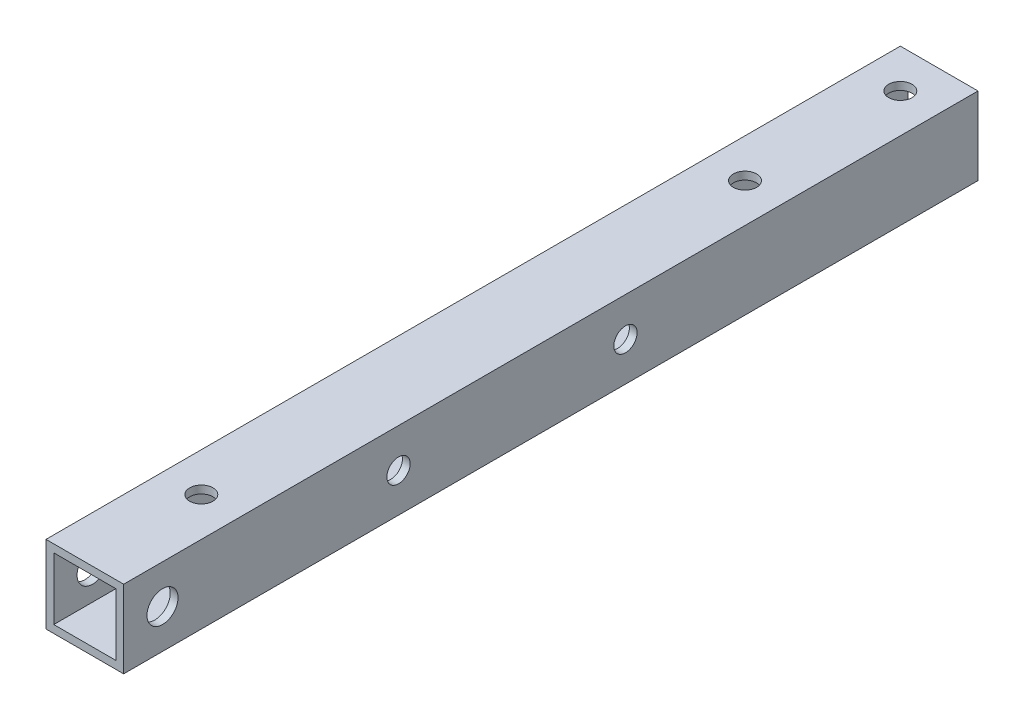
ISO-10303-21;
HEADER;
FILE_DESCRIPTION(('STEP AP214'),'2;1');
FILE_NAME('part.step','',(''),(''),'','','');
FILE_SCHEMA(('AUTOMOTIVE_DESIGN { 1 0 10303 214 1 1 1 1 }'));
ENDSEC;
DATA;
#1=APPLICATION_CONTEXT('core data for automotive mechanical design processes');
#2=APPLICATION_PROTOCOL_DEFINITION('international standard','automotive_design',2000,#1);
#3=PRODUCT_CONTEXT('',#1,'mechanical');
#4=PRODUCT('Part','Part','',(#3));
#5=PRODUCT_RELATED_PRODUCT_CATEGORY('part','',(#4));
#6=PRODUCT_DEFINITION_FORMATION('','',#4);
#7=PRODUCT_DEFINITION_CONTEXT('part definition',#1,'design');
#8=PRODUCT_DEFINITION('design','',#6,#7);
#9=PRODUCT_DEFINITION_SHAPE('','',#8);
#10=(LENGTH_UNIT() NAMED_UNIT(*) SI_UNIT(.MILLI.,.METRE.));
#11=(NAMED_UNIT(*) PLANE_ANGLE_UNIT() SI_UNIT($,.RADIAN.));
#12=(NAMED_UNIT(*) SI_UNIT($,.STERADIAN.) SOLID_ANGLE_UNIT());
#13=UNCERTAINTY_MEASURE_WITH_UNIT(LENGTH_MEASURE(1.E-05),#10,'distance_accuracy_value','');
#14=(GEOMETRIC_REPRESENTATION_CONTEXT(3) GLOBAL_UNCERTAINTY_ASSIGNED_CONTEXT((#13)) GLOBAL_UNIT_ASSIGNED_CONTEXT((#10,
#11,#12)) REPRESENTATION_CONTEXT('',''));
#15=CARTESIAN_POINT('',(0.,0.,0.));
#16=DIRECTION('',(0.,0.,1.));
#17=DIRECTION('',(1.,0.,0.));
#18=AXIS2_PLACEMENT_3D('',#15,#16,#17);
#19=CARTESIAN_POINT('',(0.,0.,100.));
#20=DIRECTION('',(0.,0.,1.));
#21=DIRECTION('',(1.,0.,0.));
#22=AXIS2_PLACEMENT_3D('',#19,#20,#21);
#23=PLANE('',#22);
#24=DIRECTION('',(0.,-1.,0.));
#25=VECTOR('',#24,1.);
#26=CARTESIAN_POINT('',(-5.,5.,100.));
#27=LINE('',#26,#25);
#28=CARTESIAN_POINT('',(-5.,5.,100.));
#29=VERTEX_POINT('',#28);
#30=CARTESIAN_POINT('',(-5.,-5.,100.));
#31=VERTEX_POINT('',#30);
#32=EDGE_CURVE('E251',#29,#31,#27,.T.);
#33=ORIENTED_EDGE('',*,*,#32,.T.);
#34=DIRECTION('',(1.,0.,0.));
#35=VECTOR('',#34,1.);
#36=CARTESIAN_POINT('',(5.,-5.,100.));
#37=LINE('',#36,#35);
#38=CARTESIAN_POINT('',(5.,-5.,100.));
#39=VERTEX_POINT('',#38);
#40=EDGE_CURVE('E253',#31,#39,#37,.T.);
#41=ORIENTED_EDGE('',*,*,#40,.T.);
#42=DIRECTION('',(0.,1.,0.));
#43=VECTOR('',#42,1.);
#44=CARTESIAN_POINT('',(5.,5.,100.));
#45=LINE('',#44,#43);
#46=CARTESIAN_POINT('',(5.,5.,100.));
#47=VERTEX_POINT('',#46);
#48=EDGE_CURVE('E255',#39,#47,#45,.T.);
#49=ORIENTED_EDGE('',*,*,#48,.T.);
#50=DIRECTION('',(-1.,0.,0.));
#51=VECTOR('',#50,1.);
#52=CARTESIAN_POINT('',(5.,5.,100.));
#53=LINE('',#52,#51);
#54=EDGE_CURVE('E108',#47,#29,#53,.T.);
#55=ORIENTED_EDGE('',*,*,#54,.T.);
#56=EDGE_LOOP('',(#33,#41,#49,#55));
#57=FACE_BOUND('',#56,.T.);
#58=DIRECTION('',(1.,0.,0.));
#59=VECTOR('',#58,1.);
#60=CARTESIAN_POINT('',(0.,-4.,100.));
#61=LINE('',#60,#59);
#62=CARTESIAN_POINT('',(-4.,-4.,100.));
#63=VERTEX_POINT('',#62);
#64=CARTESIAN_POINT('',(4.,-4.,100.));
#65=VERTEX_POINT('',#64);
#66=EDGE_CURVE('E242',#63,#65,#61,.T.);
#67=ORIENTED_EDGE('',*,*,#66,.F.);
#68=DIRECTION('',(0.,-1.,0.));
#69=VECTOR('',#68,1.);
#70=CARTESIAN_POINT('',(-4.,0.,100.));
#71=LINE('',#70,#69);
#72=CARTESIAN_POINT('',(-4.,4.,100.));
#73=VERTEX_POINT('',#72);
#74=EDGE_CURVE('E240',#73,#63,#71,.T.);
#75=ORIENTED_EDGE('',*,*,#74,.F.);
#76=DIRECTION('',(-1.,0.,0.));
#77=VECTOR('',#76,1.);
#78=CARTESIAN_POINT('',(0.,4.,100.));
#79=LINE('',#78,#77);
#80=CARTESIAN_POINT('',(4.,4.,100.));
#81=VERTEX_POINT('',#80);
#82=EDGE_CURVE('E155',#81,#73,#79,.T.);
#83=ORIENTED_EDGE('',*,*,#82,.F.);
#84=DIRECTION('',(0.,1.,0.));
#85=VECTOR('',#84,1.);
#86=CARTESIAN_POINT('',(4.,0.,100.));
#87=LINE('',#86,#85);
#88=EDGE_CURVE('E244',#65,#81,#87,.T.);
#89=ORIENTED_EDGE('',*,*,#88,.F.);
#90=EDGE_LOOP('',(#67,#75,#83,#89));
#91=FACE_BOUND('',#90,.T.);
#92=ADVANCED_FACE('F83',(#57,#91),#23,.T.);
#93=CARTESIAN_POINT('',(-5.,5.,100.));
#94=DIRECTION('',(1.,0.,0.));
#95=DIRECTION('',(0.,0.,-1.));
#96=AXIS2_PLACEMENT_3D('',#93,#94,#95);
#97=PLANE('',#96);
#98=CARTESIAN_POINT('',(-5.,0.,95.));
#99=DIRECTION('',(1.,0.,0.));
#100=DIRECTION('',(0.,0.,1.));
#101=AXIS2_PLACEMENT_3D('',#98,#99,#100);
#102=CIRCLE('',#101,2.);
#103=CARTESIAN_POINT('',(-5.,0.,97.));
#104=VERTEX_POINT('',#103);
#105=EDGE_CURVE('E198',#104,#104,#102,.T.);
#106=ORIENTED_EDGE('',*,*,#105,.T.);
#107=EDGE_LOOP('',(#106));
#108=FACE_BOUND('',#107,.T.);
#109=CARTESIAN_POINT('',(-5.,0.,35.39));
#110=DIRECTION('',(1.,0.,0.));
#111=DIRECTION('',(0.,0.,1.));
#112=AXIS2_PLACEMENT_3D('',#109,#110,#111);
#113=CIRCLE('',#112,1.5);
#114=CARTESIAN_POINT('',(-5.,0.,36.89));
#115=VERTEX_POINT('',#114);
#116=EDGE_CURVE('E191',#115,#115,#113,.T.);
#117=ORIENTED_EDGE('',*,*,#116,.T.);
#118=EDGE_LOOP('',(#117));
#119=FACE_BOUND('',#118,.T.);
#120=CARTESIAN_POINT('',(-5.,0.,64.61));
#121=DIRECTION('',(1.,0.,0.));
#122=DIRECTION('',(0.,0.,-1.));
#123=AXIS2_PLACEMENT_3D('',#120,#121,#122);
#124=CIRCLE('',#123,1.5);
#125=CARTESIAN_POINT('',(-5.,0.,63.11));
#126=VERTEX_POINT('',#125);
#127=EDGE_CURVE('E203',#126,#126,#124,.T.);
#128=ORIENTED_EDGE('',*,*,#127,.T.);
#129=EDGE_LOOP('',(#128));
#130=FACE_BOUND('',#129,.T.);
#131=DIRECTION('',(0.,0.,-1.));
#132=VECTOR('',#131,1.);
#133=CARTESIAN_POINT('',(-5.,5.,100.));
#134=LINE('',#133,#132);
#135=CARTESIAN_POINT('',(-5.,5.,-10.));
#136=VERTEX_POINT('',#135);
#137=EDGE_CURVE('E258',#29,#136,#134,.T.);
#138=ORIENTED_EDGE('',*,*,#137,.T.);
#139=DIRECTION('',(0.,1.,0.));
#140=VECTOR('',#139,1.);
#141=CARTESIAN_POINT('',(-5.,-5.,-10.));
#142=LINE('',#141,#140);
#143=CARTESIAN_POINT('',(-5.,-5.,-10.));
#144=VERTEX_POINT('',#143);
#145=EDGE_CURVE('E178',#144,#136,#142,.T.);
#146=ORIENTED_EDGE('',*,*,#145,.F.);
#147=DIRECTION('',(0.,0.,-1.));
#148=VECTOR('',#147,1.);
#149=CARTESIAN_POINT('',(-5.,-5.,100.));
#150=LINE('',#149,#148);
#151=EDGE_CURVE('E12',#31,#144,#150,.T.);
#152=ORIENTED_EDGE('',*,*,#151,.F.);
#153=ORIENTED_EDGE('',*,*,#32,.F.);
#154=EDGE_LOOP('',(#138,#146,#152,#153));
#155=FACE_BOUND('',#154,.T.);
#156=ADVANCED_FACE('F85',(#108,#119,#130,#155),#97,.F.);
#157=CARTESIAN_POINT('',(5.,-5.,100.));
#158=DIRECTION('',(0.,1.,0.));
#159=DIRECTION('',(-1.,0.,0.));
#160=AXIS2_PLACEMENT_3D('',#157,#158,#159);
#161=PLANE('',#160);
#162=CARTESIAN_POINT('',(0.,-5.,-5.));
#163=DIRECTION('',(0.,1.,0.));
#164=DIRECTION('',(-1.,0.,0.));
#165=AXIS2_PLACEMENT_3D('',#162,#163,#164);
#166=CIRCLE('',#165,1.5);
#167=CARTESIAN_POINT('',(-1.5,-5.,-5.));
#168=VERTEX_POINT('',#167);
#169=EDGE_CURVE('E322',#168,#168,#166,.T.);
#170=ORIENTED_EDGE('',*,*,#169,.T.);
#171=EDGE_LOOP('',(#170));
#172=FACE_BOUND('',#171,.T.);
#173=CARTESIAN_POINT('',(0.,-5.,15.));
#174=DIRECTION('',(0.,-1.,0.));
#175=DIRECTION('',(1.,0.,0.));
#176=AXIS2_PLACEMENT_3D('',#173,#174,#175);
#177=CIRCLE('',#176,1.5);
#178=CARTESIAN_POINT('',(1.50000000000001,-5.,15.));
#179=VERTEX_POINT('',#178);
#180=EDGE_CURVE('E225',#179,#179,#177,.T.);
#181=ORIENTED_EDGE('',*,*,#180,.F.);
#182=EDGE_LOOP('',(#181));
#183=FACE_BOUND('',#182,.T.);
#184=CARTESIAN_POINT('',(0.,-5.,85.));
#185=DIRECTION('',(0.,-1.,0.));
#186=DIRECTION('',(-1.,0.,0.));
#187=AXIS2_PLACEMENT_3D('',#184,#185,#186);
#188=CIRCLE('',#187,1.5);
#189=CARTESIAN_POINT('',(-1.49999999999999,-5.,85.));
#190=VERTEX_POINT('',#189);
#191=EDGE_CURVE('E220',#190,#190,#188,.T.);
#192=ORIENTED_EDGE('',*,*,#191,.F.);
#193=EDGE_LOOP('',(#192));
#194=FACE_BOUND('',#193,.T.);
#195=ORIENTED_EDGE('',*,*,#151,.T.);
#196=DIRECTION('',(-1.,0.,0.));
#197=VECTOR('',#196,1.);
#198=CARTESIAN_POINT('',(5.,-5.,-10.));
#199=LINE('',#198,#197);
#200=CARTESIAN_POINT('',(5.,-5.,-10.));
#201=VERTEX_POINT('',#200);
#202=EDGE_CURVE('E187',#201,#144,#199,.T.);
#203=ORIENTED_EDGE('',*,*,#202,.F.);
#204=DIRECTION('',(0.,0.,-1.));
#205=VECTOR('',#204,1.);
#206=CARTESIAN_POINT('',(5.,-5.,100.));
#207=LINE('',#206,#205);
#208=EDGE_CURVE('E92',#39,#201,#207,.T.);
#209=ORIENTED_EDGE('',*,*,#208,.F.);
#210=ORIENTED_EDGE('',*,*,#40,.F.);
#211=EDGE_LOOP('',(#195,#203,#209,#210));
#212=FACE_BOUND('',#211,.T.);
#213=ADVANCED_FACE('F306',(#172,#183,#194,#212),#161,.F.);
#214=CARTESIAN_POINT('',(5.,5.,100.));
#215=DIRECTION('',(-1.,0.,0.));
#216=DIRECTION('',(0.,0.,1.));
#217=AXIS2_PLACEMENT_3D('',#214,#215,#216);
#218=PLANE('',#217);
#219=CARTESIAN_POINT('',(5.,0.,95.));
#220=DIRECTION('',(1.,0.,0.));
#221=DIRECTION('',(0.,0.,1.));
#222=AXIS2_PLACEMENT_3D('',#219,#220,#221);
#223=CIRCLE('',#222,2.);
#224=CARTESIAN_POINT('',(5.,0.,97.));
#225=VERTEX_POINT('',#224);
#226=EDGE_CURVE('E190',#225,#225,#223,.T.);
#227=ORIENTED_EDGE('',*,*,#226,.F.);
#228=EDGE_LOOP('',(#227));
#229=FACE_BOUND('',#228,.T.);
#230=CARTESIAN_POINT('',(5.,0.,35.39));
#231=DIRECTION('',(1.,0.,0.));
#232=DIRECTION('',(0.,0.,1.));
#233=AXIS2_PLACEMENT_3D('',#230,#231,#232);
#234=CIRCLE('',#233,1.5);
#235=CARTESIAN_POINT('',(5.,0.,36.89));
#236=VERTEX_POINT('',#235);
#237=EDGE_CURVE('E195',#236,#236,#234,.T.);
#238=ORIENTED_EDGE('',*,*,#237,.F.);
#239=EDGE_LOOP('',(#238));
#240=FACE_BOUND('',#239,.T.);
#241=CARTESIAN_POINT('',(5.,0.,64.61));
#242=DIRECTION('',(1.,0.,0.));
#243=DIRECTION('',(0.,0.,-1.));
#244=AXIS2_PLACEMENT_3D('',#241,#242,#243);
#245=CIRCLE('',#244,1.5);
#246=CARTESIAN_POINT('',(5.,0.,63.11));
#247=VERTEX_POINT('',#246);
#248=EDGE_CURVE('E194',#247,#247,#245,.T.);
#249=ORIENTED_EDGE('',*,*,#248,.F.);
#250=EDGE_LOOP('',(#249));
#251=FACE_BOUND('',#250,.T.);
#252=ORIENTED_EDGE('',*,*,#208,.T.);
#253=DIRECTION('',(0.,-1.,0.));
#254=VECTOR('',#253,1.);
#255=CARTESIAN_POINT('',(5.,-5.,-10.));
#256=LINE('',#255,#254);
#257=CARTESIAN_POINT('',(5.,5.,-10.));
#258=VERTEX_POINT('',#257);
#259=EDGE_CURVE('E184',#258,#201,#256,.T.);
#260=ORIENTED_EDGE('',*,*,#259,.F.);
#261=DIRECTION('',(0.,0.,-1.));
#262=VECTOR('',#261,1.);
#263=CARTESIAN_POINT('',(5.,5.,100.));
#264=LINE('',#263,#262);
#265=EDGE_CURVE('E260',#47,#258,#264,.T.);
#266=ORIENTED_EDGE('',*,*,#265,.F.);
#267=ORIENTED_EDGE('',*,*,#48,.F.);
#268=EDGE_LOOP('',(#252,#260,#266,#267));
#269=FACE_BOUND('',#268,.T.);
#270=ADVANCED_FACE('F311',(#229,#240,#251,#269),#218,.F.);
#271=CARTESIAN_POINT('',(5.,5.,100.));
#272=DIRECTION('',(0.,-1.,0.));
#273=DIRECTION('',(1.,0.,0.));
#274=AXIS2_PLACEMENT_3D('',#271,#272,#273);
#275=PLANE('',#274);
#276=CARTESIAN_POINT('',(0.,5.,-5.));
#277=DIRECTION('',(0.,1.,0.));
#278=DIRECTION('',(-1.,0.,0.));
#279=AXIS2_PLACEMENT_3D('',#276,#277,#278);
#280=CIRCLE('',#279,1.5);
#281=CARTESIAN_POINT('',(-1.5,5.,-5.));
#282=VERTEX_POINT('',#281);
#283=EDGE_CURVE('E392',#282,#282,#280,.T.);
#284=ORIENTED_EDGE('',*,*,#283,.F.);
#285=EDGE_LOOP('',(#284));
#286=FACE_BOUND('',#285,.T.);
#287=CARTESIAN_POINT('',(0.,5.,15.));
#288=DIRECTION('',(0.,-1.,0.));
#289=DIRECTION('',(1.,0.,0.));
#290=AXIS2_PLACEMENT_3D('',#287,#288,#289);
#291=CIRCLE('',#290,1.5);
#292=CARTESIAN_POINT('',(1.50000000000001,5.,15.));
#293=VERTEX_POINT('',#292);
#294=EDGE_CURVE('E221',#293,#293,#291,.T.);
#295=ORIENTED_EDGE('',*,*,#294,.T.);
#296=EDGE_LOOP('',(#295));
#297=FACE_BOUND('',#296,.T.);
#298=CARTESIAN_POINT('',(0.,5.,85.));
#299=DIRECTION('',(0.,-1.,0.));
#300=DIRECTION('',(-1.,0.,0.));
#301=AXIS2_PLACEMENT_3D('',#298,#299,#300);
#302=CIRCLE('',#301,1.5);
#303=CARTESIAN_POINT('',(-1.49999999999999,5.,85.));
#304=VERTEX_POINT('',#303);
#305=EDGE_CURVE('E228',#304,#304,#302,.T.);
#306=ORIENTED_EDGE('',*,*,#305,.T.);
#307=EDGE_LOOP('',(#306));
#308=FACE_BOUND('',#307,.T.);
#309=ORIENTED_EDGE('',*,*,#265,.T.);
#310=DIRECTION('',(1.,0.,0.));
#311=VECTOR('',#310,1.);
#312=CARTESIAN_POINT('',(5.,5.,-10.));
#313=LINE('',#312,#311);
#314=EDGE_CURVE('E181',#136,#258,#313,.T.);
#315=ORIENTED_EDGE('',*,*,#314,.F.);
#316=ORIENTED_EDGE('',*,*,#137,.F.);
#317=ORIENTED_EDGE('',*,*,#54,.F.);
#318=EDGE_LOOP('',(#309,#315,#316,#317));
#319=FACE_BOUND('',#318,.T.);
#320=ADVANCED_FACE('F296',(#286,#297,#308,#319),#275,.F.);
#321=CARTESIAN_POINT('',(-4.,0.,100.));
#322=DIRECTION('',(1.,0.,0.));
#323=DIRECTION('',(0.,0.,-1.));
#324=AXIS2_PLACEMENT_3D('',#321,#322,#323);
#325=PLANE('',#324);
#326=CARTESIAN_POINT('',(-4.,0.,95.));
#327=DIRECTION('',(1.,0.,0.));
#328=DIRECTION('',(0.,0.,-1.));
#329=AXIS2_PLACEMENT_3D('',#326,#327,#328);
#330=CIRCLE('',#329,2.);
#331=CARTESIAN_POINT('',(-4.,0.,93.));
#332=VERTEX_POINT('',#331);
#333=EDGE_CURVE('E217',#332,#332,#330,.T.);
#334=ORIENTED_EDGE('',*,*,#333,.F.);
#335=EDGE_LOOP('',(#334));
#336=FACE_BOUND('',#335,.T.);
#337=CARTESIAN_POINT('',(-4.,0.,35.39));
#338=DIRECTION('',(1.,0.,0.));
#339=DIRECTION('',(0.,0.,-1.));
#340=AXIS2_PLACEMENT_3D('',#337,#338,#339);
#341=CIRCLE('',#340,1.5);
#342=CARTESIAN_POINT('',(-4.,0.,33.89));
#343=VERTEX_POINT('',#342);
#344=EDGE_CURVE('E213',#343,#343,#341,.T.);
#345=ORIENTED_EDGE('',*,*,#344,.F.);
#346=EDGE_LOOP('',(#345));
#347=FACE_BOUND('',#346,.T.);
#348=CARTESIAN_POINT('',(-4.,0.,64.61));
#349=DIRECTION('',(1.,0.,0.));
#350=DIRECTION('',(0.,0.,-1.));
#351=AXIS2_PLACEMENT_3D('',#348,#349,#350);
#352=CIRCLE('',#351,1.5);
#353=CARTESIAN_POINT('',(-4.,0.,63.11));
#354=VERTEX_POINT('',#353);
#355=EDGE_CURVE('E209',#354,#354,#352,.T.);
#356=ORIENTED_EDGE('',*,*,#355,.F.);
#357=EDGE_LOOP('',(#356));
#358=FACE_BOUND('',#357,.T.);
#359=DIRECTION('',(0.,0.,-1.));
#360=VECTOR('',#359,1.);
#361=CARTESIAN_POINT('',(-4.,-4.,100.));
#362=LINE('',#361,#360);
#363=CARTESIAN_POINT('',(-4.,-4.,-10.));
#364=VERTEX_POINT('',#363);
#365=EDGE_CURVE('E163',#63,#364,#362,.T.);
#366=ORIENTED_EDGE('',*,*,#365,.T.);
#367=DIRECTION('',(0.,1.,0.));
#368=VECTOR('',#367,1.);
#369=CARTESIAN_POINT('',(-4.,0.,-10.));
#370=LINE('',#369,#368);
#371=CARTESIAN_POINT('',(-4.,4.,-10.));
#372=VERTEX_POINT('',#371);
#373=EDGE_CURVE('E160',#364,#372,#370,.T.);
#374=ORIENTED_EDGE('',*,*,#373,.T.);
#375=DIRECTION('',(0.,0.,-1.));
#376=VECTOR('',#375,1.);
#377=CARTESIAN_POINT('',(-4.,4.,100.));
#378=LINE('',#377,#376);
#379=EDGE_CURVE('E148',#73,#372,#378,.T.);
#380=ORIENTED_EDGE('',*,*,#379,.F.);
#381=ORIENTED_EDGE('',*,*,#74,.T.);
#382=EDGE_LOOP('',(#366,#374,#380,#381));
#383=FACE_BOUND('',#382,.T.);
#384=ADVANCED_FACE('F161',(#336,#347,#358,#383),#325,.T.);
#385=CARTESIAN_POINT('',(0.,-4.,100.));
#386=DIRECTION('',(0.,1.,0.));
#387=DIRECTION('',(-1.,0.,0.));
#388=AXIS2_PLACEMENT_3D('',#385,#386,#387);
#389=PLANE('',#388);
#390=CARTESIAN_POINT('',(0.,-4.,-5.));
#391=DIRECTION('',(0.,1.,0.));
#392=DIRECTION('',(-1.,0.,0.));
#393=AXIS2_PLACEMENT_3D('',#390,#391,#392);
#394=CIRCLE('',#393,1.5);
#395=CARTESIAN_POINT('',(-1.5,-4.,-5.));
#396=VERTEX_POINT('',#395);
#397=EDGE_CURVE('E167',#396,#396,#394,.T.);
#398=ORIENTED_EDGE('',*,*,#397,.F.);
#399=EDGE_LOOP('',(#398));
#400=FACE_BOUND('',#399,.T.);
#401=CARTESIAN_POINT('',(0.,-4.,15.));
#402=DIRECTION('',(0.,1.,0.));
#403=DIRECTION('',(-1.,0.,0.));
#404=AXIS2_PLACEMENT_3D('',#401,#402,#403);
#405=CIRCLE('',#404,1.5);
#406=CARTESIAN_POINT('',(-1.49999999999999,-4.,15.));
#407=VERTEX_POINT('',#406);
#408=EDGE_CURVE('E237',#407,#407,#405,.T.);
#409=ORIENTED_EDGE('',*,*,#408,.F.);
#410=EDGE_LOOP('',(#409));
#411=FACE_BOUND('',#410,.T.);
#412=CARTESIAN_POINT('',(0.,-4.,85.));
#413=DIRECTION('',(0.,1.,0.));
#414=DIRECTION('',(-1.,0.,0.));
#415=AXIS2_PLACEMENT_3D('',#412,#413,#414);
#416=CIRCLE('',#415,1.5);
#417=CARTESIAN_POINT('',(-1.49999999999999,-4.,85.));
#418=VERTEX_POINT('',#417);
#419=EDGE_CURVE('E233',#418,#418,#416,.T.);
#420=ORIENTED_EDGE('',*,*,#419,.F.);
#421=EDGE_LOOP('',(#420));
#422=FACE_BOUND('',#421,.T.);
#423=DIRECTION('',(0.,0.,-1.));
#424=VECTOR('',#423,1.);
#425=CARTESIAN_POINT('',(4.,-4.,100.));
#426=LINE('',#425,#424);
#427=CARTESIAN_POINT('',(4.,-4.,-10.));
#428=VERTEX_POINT('',#427);
#429=EDGE_CURVE('E248',#65,#428,#426,.T.);
#430=ORIENTED_EDGE('',*,*,#429,.T.);
#431=DIRECTION('',(-1.,0.,0.));
#432=VECTOR('',#431,1.);
#433=CARTESIAN_POINT('',(0.,-4.,-10.));
#434=LINE('',#433,#432);
#435=EDGE_CURVE('E173',#428,#364,#434,.T.);
#436=ORIENTED_EDGE('',*,*,#435,.T.);
#437=ORIENTED_EDGE('',*,*,#365,.F.);
#438=ORIENTED_EDGE('',*,*,#66,.T.);
#439=EDGE_LOOP('',(#430,#436,#437,#438));
#440=FACE_BOUND('',#439,.T.);
#441=ADVANCED_FACE('F279',(#400,#411,#422,#440),#389,.T.);
#442=CARTESIAN_POINT('',(4.,0.,100.));
#443=DIRECTION('',(-1.,0.,0.));
#444=DIRECTION('',(0.,0.,1.));
#445=AXIS2_PLACEMENT_3D('',#442,#443,#444);
#446=PLANE('',#445);
#447=CARTESIAN_POINT('',(4.,0.,95.));
#448=DIRECTION('',(-1.,0.,0.));
#449=DIRECTION('',(0.,0.,1.));
#450=AXIS2_PLACEMENT_3D('',#447,#448,#449);
#451=CIRCLE('',#450,2.);
#452=CARTESIAN_POINT('',(4.,0.,97.));
#453=VERTEX_POINT('',#452);
#454=EDGE_CURVE('E216',#453,#453,#451,.T.);
#455=ORIENTED_EDGE('',*,*,#454,.F.);
#456=EDGE_LOOP('',(#455));
#457=FACE_BOUND('',#456,.T.);
#458=CARTESIAN_POINT('',(4.,0.,35.39));
#459=DIRECTION('',(-1.,0.,0.));
#460=DIRECTION('',(0.,0.,1.));
#461=AXIS2_PLACEMENT_3D('',#458,#459,#460);
#462=CIRCLE('',#461,1.5);
#463=CARTESIAN_POINT('',(4.,0.,36.89));
#464=VERTEX_POINT('',#463);
#465=EDGE_CURVE('E212',#464,#464,#462,.T.);
#466=ORIENTED_EDGE('',*,*,#465,.F.);
#467=EDGE_LOOP('',(#466));
#468=FACE_BOUND('',#467,.T.);
#469=CARTESIAN_POINT('',(4.,0.,64.61));
#470=DIRECTION('',(-1.,0.,0.));
#471=DIRECTION('',(0.,0.,1.));
#472=AXIS2_PLACEMENT_3D('',#469,#470,#471);
#473=CIRCLE('',#472,1.5);
#474=CARTESIAN_POINT('',(4.,0.,66.11));
#475=VERTEX_POINT('',#474);
#476=EDGE_CURVE('E206',#475,#475,#473,.T.);
#477=ORIENTED_EDGE('',*,*,#476,.F.);
#478=EDGE_LOOP('',(#477));
#479=FACE_BOUND('',#478,.T.);
#480=DIRECTION('',(0.,0.,-1.));
#481=VECTOR('',#480,1.);
#482=CARTESIAN_POINT('',(4.,4.,100.));
#483=LINE('',#482,#481);
#484=CARTESIAN_POINT('',(4.,4.,-10.));
#485=VERTEX_POINT('',#484);
#486=EDGE_CURVE('E100',#81,#485,#483,.T.);
#487=ORIENTED_EDGE('',*,*,#486,.T.);
#488=DIRECTION('',(0.,-1.,0.));
#489=VECTOR('',#488,1.);
#490=CARTESIAN_POINT('',(4.,0.,-10.));
#491=LINE('',#490,#489);
#492=EDGE_CURVE('E171',#485,#428,#491,.T.);
#493=ORIENTED_EDGE('',*,*,#492,.T.);
#494=ORIENTED_EDGE('',*,*,#429,.F.);
#495=ORIENTED_EDGE('',*,*,#88,.T.);
#496=EDGE_LOOP('',(#487,#493,#494,#495));
#497=FACE_BOUND('',#496,.T.);
#498=ADVANCED_FACE('F276',(#457,#468,#479,#497),#446,.T.);
#499=CARTESIAN_POINT('',(0.,4.,100.));
#500=DIRECTION('',(0.,-1.,0.));
#501=DIRECTION('',(1.,0.,0.));
#502=AXIS2_PLACEMENT_3D('',#499,#500,#501);
#503=PLANE('',#502);
#504=CARTESIAN_POINT('',(0.,4.,-5.));
#505=DIRECTION('',(0.,-1.,0.));
#506=DIRECTION('',(1.,0.,0.));
#507=AXIS2_PLACEMENT_3D('',#504,#505,#506);
#508=CIRCLE('',#507,1.5);
#509=CARTESIAN_POINT('',(1.5,4.,-5.));
#510=VERTEX_POINT('',#509);
#511=EDGE_CURVE('E87',#510,#510,#508,.T.);
#512=ORIENTED_EDGE('',*,*,#511,.F.);
#513=EDGE_LOOP('',(#512));
#514=FACE_BOUND('',#513,.T.);
#515=CARTESIAN_POINT('',(0.,4.,15.));
#516=DIRECTION('',(0.,-1.,0.));
#517=DIRECTION('',(1.,0.,0.));
#518=AXIS2_PLACEMENT_3D('',#515,#516,#517);
#519=CIRCLE('',#518,1.5);
#520=CARTESIAN_POINT('',(1.50000000000001,4.,15.));
#521=VERTEX_POINT('',#520);
#522=EDGE_CURVE('E236',#521,#521,#519,.T.);
#523=ORIENTED_EDGE('',*,*,#522,.F.);
#524=EDGE_LOOP('',(#523));
#525=FACE_BOUND('',#524,.T.);
#526=CARTESIAN_POINT('',(0.,4.,85.));
#527=DIRECTION('',(0.,-1.,0.));
#528=DIRECTION('',(1.,0.,0.));
#529=AXIS2_PLACEMENT_3D('',#526,#527,#528);
#530=CIRCLE('',#529,1.5);
#531=CARTESIAN_POINT('',(1.50000000000001,4.,85.));
#532=VERTEX_POINT('',#531);
#533=EDGE_CURVE('E224',#532,#532,#530,.T.);
#534=ORIENTED_EDGE('',*,*,#533,.F.);
#535=EDGE_LOOP('',(#534));
#536=FACE_BOUND('',#535,.T.);
#537=ORIENTED_EDGE('',*,*,#379,.T.);
#538=DIRECTION('',(1.,0.,0.));
#539=VECTOR('',#538,1.);
#540=CARTESIAN_POINT('',(0.,4.,-10.));
#541=LINE('',#540,#539);
#542=EDGE_CURVE('E152',#372,#485,#541,.T.);
#543=ORIENTED_EDGE('',*,*,#542,.T.);
#544=ORIENTED_EDGE('',*,*,#486,.F.);
#545=ORIENTED_EDGE('',*,*,#82,.T.);
#546=EDGE_LOOP('',(#537,#543,#544,#545));
#547=FACE_BOUND('',#546,.T.);
#548=ADVANCED_FACE('F150',(#514,#525,#536,#547),#503,.T.);
#549=CARTESIAN_POINT('',(0.,5.,85.));
#550=DIRECTION('',(0.,-1.,0.));
#551=DIRECTION('',(1.,0.,0.));
#552=AXIS2_PLACEMENT_3D('',#549,#550,#551);
#553=CYLINDRICAL_SURFACE('',#552,1.5);
#554=ORIENTED_EDGE('',*,*,#533,.T.);
#555=EDGE_LOOP('',(#554));
#556=FACE_BOUND('',#555,.T.);
#557=ORIENTED_EDGE('',*,*,#305,.F.);
#558=EDGE_LOOP('',(#557));
#559=FACE_BOUND('',#558,.T.);
#560=ADVANCED_FACE('F370',(#556,#559),#553,.F.);
#561=CARTESIAN_POINT('',(0.,5.,15.));
#562=DIRECTION('',(0.,-1.,0.));
#563=DIRECTION('',(1.,0.,0.));
#564=AXIS2_PLACEMENT_3D('',#561,#562,#563);
#565=CYLINDRICAL_SURFACE('',#564,1.5);
#566=ORIENTED_EDGE('',*,*,#522,.T.);
#567=EDGE_LOOP('',(#566));
#568=FACE_BOUND('',#567,.T.);
#569=ORIENTED_EDGE('',*,*,#294,.F.);
#570=EDGE_LOOP('',(#569));
#571=FACE_BOUND('',#570,.T.);
#572=ADVANCED_FACE('F366',(#568,#571),#565,.F.);
#573=ORIENTED_EDGE('',*,*,#419,.T.);
#574=EDGE_LOOP('',(#573));
#575=FACE_BOUND('',#574,.T.);
#576=ORIENTED_EDGE('',*,*,#191,.T.);
#577=EDGE_LOOP('',(#576));
#578=FACE_BOUND('',#577,.T.);
#579=ADVANCED_FACE('F369',(#575,#578),#553,.F.);
#580=ORIENTED_EDGE('',*,*,#408,.T.);
#581=EDGE_LOOP('',(#580));
#582=FACE_BOUND('',#581,.T.);
#583=ORIENTED_EDGE('',*,*,#180,.T.);
#584=EDGE_LOOP('',(#583));
#585=FACE_BOUND('',#584,.T.);
#586=ADVANCED_FACE('F364',(#582,#585),#565,.F.);
#587=CARTESIAN_POINT('',(-5.,0.,64.61));
#588=DIRECTION('',(1.,0.,0.));
#589=DIRECTION('',(0.,0.,-1.));
#590=AXIS2_PLACEMENT_3D('',#587,#588,#589);
#591=CYLINDRICAL_SURFACE('',#590,1.5);
#592=ORIENTED_EDGE('',*,*,#476,.T.);
#593=EDGE_LOOP('',(#592));
#594=FACE_BOUND('',#593,.T.);
#595=ORIENTED_EDGE('',*,*,#248,.T.);
#596=EDGE_LOOP('',(#595));
#597=FACE_BOUND('',#596,.T.);
#598=ADVANCED_FACE('F357',(#594,#597),#591,.F.);
#599=CARTESIAN_POINT('',(-5.,0.,35.39));
#600=DIRECTION('',(1.,0.,0.));
#601=DIRECTION('',(0.,0.,-1.));
#602=AXIS2_PLACEMENT_3D('',#599,#600,#601);
#603=CYLINDRICAL_SURFACE('',#602,1.5);
#604=ORIENTED_EDGE('',*,*,#465,.T.);
#605=EDGE_LOOP('',(#604));
#606=FACE_BOUND('',#605,.T.);
#607=ORIENTED_EDGE('',*,*,#237,.T.);
#608=EDGE_LOOP('',(#607));
#609=FACE_BOUND('',#608,.T.);
#610=ADVANCED_FACE('F355',(#606,#609),#603,.F.);
#611=CARTESIAN_POINT('',(-5.,0.,95.));
#612=DIRECTION('',(1.,0.,0.));
#613=DIRECTION('',(0.,0.,-1.));
#614=AXIS2_PLACEMENT_3D('',#611,#612,#613);
#615=CYLINDRICAL_SURFACE('',#614,2.);
#616=ORIENTED_EDGE('',*,*,#454,.T.);
#617=EDGE_LOOP('',(#616));
#618=FACE_BOUND('',#617,.T.);
#619=ORIENTED_EDGE('',*,*,#226,.T.);
#620=EDGE_LOOP('',(#619));
#621=FACE_BOUND('',#620,.T.);
#622=ADVANCED_FACE('F273',(#618,#621),#615,.F.);
#623=ORIENTED_EDGE('',*,*,#355,.T.);
#624=EDGE_LOOP('',(#623));
#625=FACE_BOUND('',#624,.T.);
#626=ORIENTED_EDGE('',*,*,#127,.F.);
#627=EDGE_LOOP('',(#626));
#628=FACE_BOUND('',#627,.T.);
#629=ADVANCED_FACE('F361',(#625,#628),#591,.F.);
#630=ORIENTED_EDGE('',*,*,#344,.T.);
#631=EDGE_LOOP('',(#630));
#632=FACE_BOUND('',#631,.T.);
#633=ORIENTED_EDGE('',*,*,#116,.F.);
#634=EDGE_LOOP('',(#633));
#635=FACE_BOUND('',#634,.T.);
#636=ADVANCED_FACE('F351',(#632,#635),#603,.F.);
#637=ORIENTED_EDGE('',*,*,#333,.T.);
#638=EDGE_LOOP('',(#637));
#639=FACE_BOUND('',#638,.T.);
#640=ORIENTED_EDGE('',*,*,#105,.F.);
#641=EDGE_LOOP('',(#640));
#642=FACE_BOUND('',#641,.T.);
#643=ADVANCED_FACE('F342',(#639,#642),#615,.F.);
#644=CARTESIAN_POINT('',(0.,0.,-10.));
#645=DIRECTION('',(0.,0.,-1.));
#646=DIRECTION('',(-1.,0.,0.));
#647=AXIS2_PLACEMENT_3D('',#644,#645,#646);
#648=PLANE('',#647);
#649=ORIENTED_EDGE('',*,*,#145,.T.);
#650=ORIENTED_EDGE('',*,*,#314,.T.);
#651=ORIENTED_EDGE('',*,*,#259,.T.);
#652=ORIENTED_EDGE('',*,*,#202,.T.);
#653=EDGE_LOOP('',(#649,#650,#651,#652));
#654=FACE_BOUND('',#653,.T.);
#655=ORIENTED_EDGE('',*,*,#542,.F.);
#656=ORIENTED_EDGE('',*,*,#373,.F.);
#657=ORIENTED_EDGE('',*,*,#435,.F.);
#658=ORIENTED_EDGE('',*,*,#492,.F.);
#659=EDGE_LOOP('',(#655,#656,#657,#658));
#660=FACE_BOUND('',#659,.T.);
#661=ADVANCED_FACE('F169',(#654,#660),#648,.T.);
#662=CARTESIAN_POINT('',(0.,-5.,-5.));
#663=DIRECTION('',(0.,1.,0.));
#664=DIRECTION('',(-1.,0.,0.));
#665=AXIS2_PLACEMENT_3D('',#662,#663,#664);
#666=CYLINDRICAL_SURFACE('',#665,1.5);
#667=ORIENTED_EDGE('',*,*,#511,.T.);
#668=EDGE_LOOP('',(#667));
#669=FACE_BOUND('',#668,.T.);
#670=ORIENTED_EDGE('',*,*,#283,.T.);
#671=EDGE_LOOP('',(#670));
#672=FACE_BOUND('',#671,.T.);
#673=ADVANCED_FACE('F341',(#669,#672),#666,.F.);
#674=ORIENTED_EDGE('',*,*,#397,.T.);
#675=EDGE_LOOP('',(#674));
#676=FACE_BOUND('',#675,.T.);
#677=ORIENTED_EDGE('',*,*,#169,.F.);
#678=EDGE_LOOP('',(#677));
#679=FACE_BOUND('',#678,.T.);
#680=ADVANCED_FACE('F348',(#676,#679),#666,.F.);
#681=CLOSED_SHELL('',(#92,#156,#213,#270,#320,#384,#441,#498,#548,#560,#572,#579,#586,#598,#610,
#622,#629,#636,#643,#661,#673,#680));
#682=MANIFOLD_SOLID_BREP('B2',#681);
#683=ADVANCED_BREP_SHAPE_REPRESENTATION('',(#18,#682),#14);
#684=SHAPE_DEFINITION_REPRESENTATION(#9,#683);
ENDSEC;
END-ISO-10303-21;
